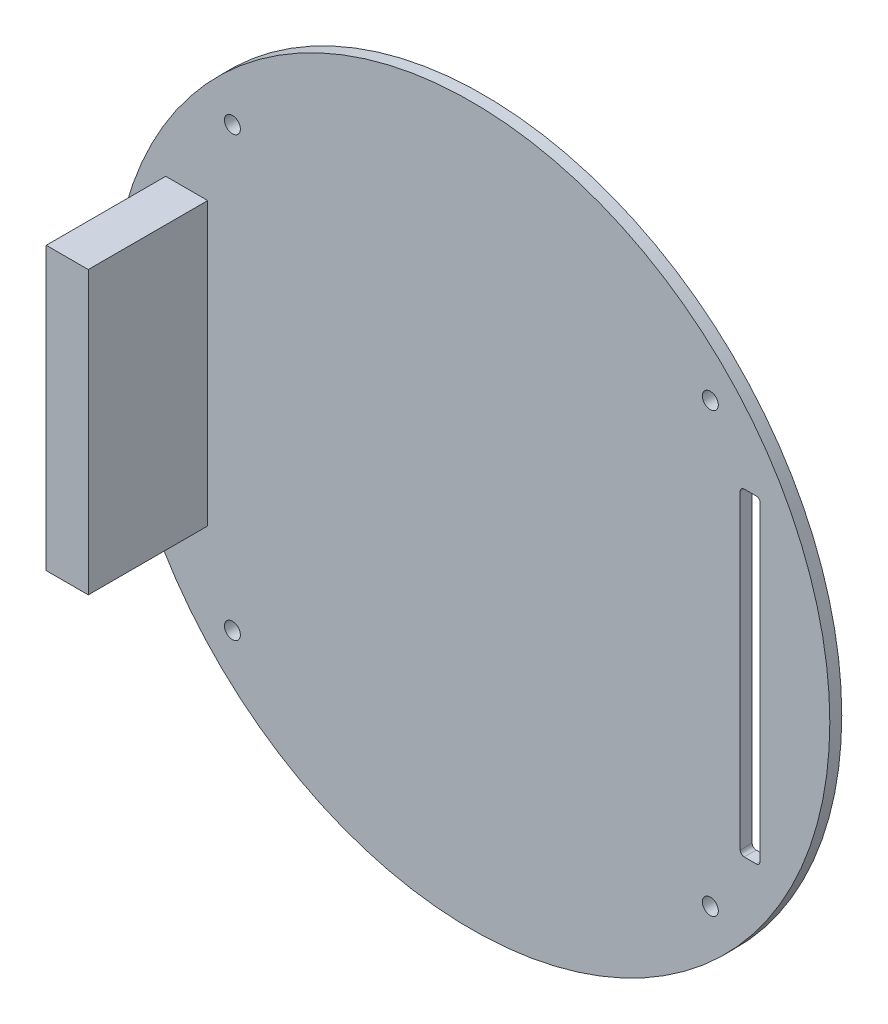
ISO-10303-21;
HEADER;
FILE_DESCRIPTION(('STEP AP214'),'2;1');
FILE_NAME('part.step','',(''),(''),'','','');
FILE_SCHEMA(('AUTOMOTIVE_DESIGN { 1 0 10303 214 1 1 1 1 }'));
ENDSEC;
DATA;
#1=APPLICATION_CONTEXT('core data for automotive mechanical design processes');
#2=APPLICATION_PROTOCOL_DEFINITION('international standard','automotive_design',2000,#1);
#3=PRODUCT_CONTEXT('',#1,'mechanical');
#4=PRODUCT('Part','Part','',(#3));
#5=PRODUCT_RELATED_PRODUCT_CATEGORY('part','',(#4));
#6=PRODUCT_DEFINITION_FORMATION('','',#4);
#7=PRODUCT_DEFINITION_CONTEXT('part definition',#1,'design');
#8=PRODUCT_DEFINITION('design','',#6,#7);
#9=PRODUCT_DEFINITION_SHAPE('','',#8);
#10=(LENGTH_UNIT() NAMED_UNIT(*) SI_UNIT(.MILLI.,.METRE.));
#11=(NAMED_UNIT(*) PLANE_ANGLE_UNIT() SI_UNIT($,.RADIAN.));
#12=(NAMED_UNIT(*) SI_UNIT($,.STERADIAN.) SOLID_ANGLE_UNIT());
#13=UNCERTAINTY_MEASURE_WITH_UNIT(LENGTH_MEASURE(1.E-05),#10,'distance_accuracy_value','');
#14=(GEOMETRIC_REPRESENTATION_CONTEXT(3) GLOBAL_UNCERTAINTY_ASSIGNED_CONTEXT((#13)) GLOBAL_UNIT_ASSIGNED_CONTEXT((#10,
#11,#12)) REPRESENTATION_CONTEXT('',''));
#15=CARTESIAN_POINT('',(0.,0.,0.));
#16=DIRECTION('',(0.,0.,1.));
#17=DIRECTION('',(1.,0.,0.));
#18=AXIS2_PLACEMENT_3D('',#15,#16,#17);
#19=CARTESIAN_POINT('',(0.,0.,3.));
#20=DIRECTION('',(0.,0.,1.));
#21=DIRECTION('',(1.,0.,0.));
#22=AXIS2_PLACEMENT_3D('',#19,#20,#21);
#23=PLANE('',#22);
#24=CARTESIAN_POINT('',(71.5,39.,3.));
#25=DIRECTION('',(0.,0.,1.));
#26=DIRECTION('',(-1.,0.,0.));
#27=AXIS2_PLACEMENT_3D('',#24,#25,#26);
#28=CIRCLE('',#27,1.);
#29=CARTESIAN_POINT('',(72.5,39.,3.));
#30=VERTEX_POINT('',#29);
#31=CARTESIAN_POINT('',(71.5,40.,3.));
#32=VERTEX_POINT('',#31);
#33=EDGE_CURVE('E62',#30,#32,#28,.T.);
#34=ORIENTED_EDGE('',*,*,#33,.F.);
#35=DIRECTION('',(0.,1.,0.));
#36=VECTOR('',#35,1.);
#37=CARTESIAN_POINT('',(72.5,-39.,3.));
#38=LINE('',#37,#36);
#39=CARTESIAN_POINT('',(72.5,-39.,3.));
#40=VERTEX_POINT('',#39);
#41=EDGE_CURVE('E169',#40,#30,#38,.T.);
#42=ORIENTED_EDGE('',*,*,#41,.F.);
#43=CARTESIAN_POINT('',(71.5,-39.,3.));
#44=DIRECTION('',(0.,0.,1.));
#45=DIRECTION('',(1.,0.,0.));
#46=AXIS2_PLACEMENT_3D('',#43,#44,#45);
#47=CIRCLE('',#46,1.);
#48=CARTESIAN_POINT('',(71.5,-40.,3.));
#49=VERTEX_POINT('',#48);
#50=EDGE_CURVE('E166',#49,#40,#47,.T.);
#51=ORIENTED_EDGE('',*,*,#50,.F.);
#52=DIRECTION('',(1.,0.,0.));
#53=VECTOR('',#52,1.);
#54=CARTESIAN_POINT('',(68.5,-40.,3.));
#55=LINE('',#54,#53);
#56=CARTESIAN_POINT('',(68.5,-40.,3.));
#57=VERTEX_POINT('',#56);
#58=EDGE_CURVE('E163',#57,#49,#55,.T.);
#59=ORIENTED_EDGE('',*,*,#58,.F.);
#60=CARTESIAN_POINT('',(68.5,-39.,3.));
#61=DIRECTION('',(0.,0.,1.));
#62=DIRECTION('',(-1.,0.,0.));
#63=AXIS2_PLACEMENT_3D('',#60,#61,#62);
#64=CIRCLE('',#63,1.);
#65=CARTESIAN_POINT('',(67.5,-39.,3.));
#66=VERTEX_POINT('',#65);
#67=EDGE_CURVE('E157',#66,#57,#64,.T.);
#68=ORIENTED_EDGE('',*,*,#67,.F.);
#69=DIRECTION('',(0.,-1.,0.));
#70=VECTOR('',#69,1.);
#71=CARTESIAN_POINT('',(67.5,-39.,3.));
#72=LINE('',#71,#70);
#73=CARTESIAN_POINT('',(67.5,39.,3.));
#74=VERTEX_POINT('',#73);
#75=EDGE_CURVE('E155',#74,#66,#72,.T.);
#76=ORIENTED_EDGE('',*,*,#75,.F.);
#77=CARTESIAN_POINT('',(68.5,39.,3.));
#78=DIRECTION('',(0.,0.,1.));
#79=DIRECTION('',(-1.,0.,0.));
#80=AXIS2_PLACEMENT_3D('',#77,#78,#79);
#81=CIRCLE('',#80,1.);
#82=CARTESIAN_POINT('',(68.5,40.,3.));
#83=VERTEX_POINT('',#82);
#84=EDGE_CURVE('E139',#83,#74,#81,.T.);
#85=ORIENTED_EDGE('',*,*,#84,.F.);
#86=DIRECTION('',(-1.,0.,0.));
#87=VECTOR('',#86,1.);
#88=CARTESIAN_POINT('',(68.5,40.,3.));
#89=LINE('',#88,#87);
#90=EDGE_CURVE('E148',#32,#83,#89,.T.);
#91=ORIENTED_EDGE('',*,*,#90,.F.);
#92=EDGE_LOOP('',(#34,#42,#51,#59,#68,#76,#85,#91));
#93=FACE_BOUND('',#92,.T.);
#94=DIRECTION('',(0.,-1.,0.));
#95=VECTOR('',#94,1.);
#96=CARTESIAN_POINT('',(-66.1949460648351,-35.37592226291,3.));
#97=LINE('',#96,#95);
#98=CARTESIAN_POINT('',(-66.1949460648351,35.3759222629101,3.));
#99=VERTEX_POINT('',#98);
#100=CARTESIAN_POINT('',(-66.1949460648351,-35.37592226291,3.));
#101=VERTEX_POINT('',#100);
#102=EDGE_CURVE('E174',#99,#101,#97,.T.);
#103=ORIENTED_EDGE('',*,*,#102,.T.);
#104=DIRECTION('',(-1.,0.,0.));
#105=VECTOR('',#104,1.);
#106=CARTESIAN_POINT('',(-76.7477635534321,-35.37592226291,3.));
#107=LINE('',#106,#105);
#108=CARTESIAN_POINT('',(-76.7477635534321,-35.37592226291,3.));
#109=VERTEX_POINT('',#108);
#110=EDGE_CURVE('E200',#101,#109,#107,.T.);
#111=ORIENTED_EDGE('',*,*,#110,.T.);
#112=DIRECTION('',(0.,1.,0.));
#113=VECTOR('',#112,1.);
#114=CARTESIAN_POINT('',(-76.7477635534321,-35.37592226291,3.));
#115=LINE('',#114,#113);
#116=CARTESIAN_POINT('',(-76.7477635534321,35.3759222629101,3.));
#117=VERTEX_POINT('',#116);
#118=EDGE_CURVE('E202',#109,#117,#115,.T.);
#119=ORIENTED_EDGE('',*,*,#118,.T.);
#120=DIRECTION('',(1.,0.,0.));
#121=VECTOR('',#120,1.);
#122=CARTESIAN_POINT('',(-76.7477635534321,35.3759222629101,3.));
#123=LINE('',#122,#121);
#124=EDGE_CURVE('E189',#117,#99,#123,.T.);
#125=ORIENTED_EDGE('',*,*,#124,.T.);
#126=EDGE_LOOP('',(#103,#111,#119,#125));
#127=FACE_BOUND('',#126,.T.);
#128=CARTESIAN_POINT('',(60.,55.,3.));
#129=DIRECTION('',(0.,0.,1.));
#130=DIRECTION('',(1.,0.,0.));
#131=AXIS2_PLACEMENT_3D('',#128,#129,#130);
#132=CIRCLE('',#131,2.);
#133=CARTESIAN_POINT('',(62.,55.,3.));
#134=VERTEX_POINT('',#133);
#135=EDGE_CURVE('E223',#134,#134,#132,.T.);
#136=ORIENTED_EDGE('',*,*,#135,.F.);
#137=EDGE_LOOP('',(#136));
#138=FACE_BOUND('',#137,.T.);
#139=CARTESIAN_POINT('',(-60.,-55.,3.));
#140=DIRECTION('',(0.,0.,1.));
#141=DIRECTION('',(1.,0.,0.));
#142=AXIS2_PLACEMENT_3D('',#139,#140,#141);
#143=CIRCLE('',#142,2.);
#144=CARTESIAN_POINT('',(-58.,-55.,3.));
#145=VERTEX_POINT('',#144);
#146=EDGE_CURVE('E235',#145,#145,#143,.T.);
#147=ORIENTED_EDGE('',*,*,#146,.F.);
#148=EDGE_LOOP('',(#147));
#149=FACE_BOUND('',#148,.T.);
#150=CARTESIAN_POINT('',(0.,0.,3.));
#151=DIRECTION('',(0.,0.,1.));
#152=DIRECTION('',(1.,0.,0.));
#153=AXIS2_PLACEMENT_3D('',#150,#151,#152);
#154=CIRCLE('',#153,90.);
#155=CARTESIAN_POINT('',(90.,0.,3.));
#156=VERTEX_POINT('',#155);
#157=EDGE_CURVE('E241',#156,#156,#154,.T.);
#158=ORIENTED_EDGE('',*,*,#157,.T.);
#159=EDGE_LOOP('',(#158));
#160=FACE_BOUND('',#159,.T.);
#161=CARTESIAN_POINT('',(-60.,55.,3.));
#162=DIRECTION('',(0.,0.,1.));
#163=DIRECTION('',(1.,0.,0.));
#164=AXIS2_PLACEMENT_3D('',#161,#162,#163);
#165=CIRCLE('',#164,2.);
#166=CARTESIAN_POINT('',(-58.,55.,3.));
#167=VERTEX_POINT('',#166);
#168=EDGE_CURVE('E229',#167,#167,#165,.T.);
#169=ORIENTED_EDGE('',*,*,#168,.F.);
#170=EDGE_LOOP('',(#169));
#171=FACE_BOUND('',#170,.T.);
#172=CARTESIAN_POINT('',(60.,-55.,3.));
#173=DIRECTION('',(0.,0.,1.));
#174=DIRECTION('',(1.,0.,0.));
#175=AXIS2_PLACEMENT_3D('',#172,#173,#174);
#176=CIRCLE('',#175,2.);
#177=CARTESIAN_POINT('',(62.,-55.,3.));
#178=VERTEX_POINT('',#177);
#179=EDGE_CURVE('E217',#178,#178,#176,.T.);
#180=ORIENTED_EDGE('',*,*,#179,.F.);
#181=EDGE_LOOP('',(#180));
#182=FACE_BOUND('',#181,.T.);
#183=ADVANCED_FACE('F47',(#93,#127,#138,#149,#160,#171,#182),#23,.T.);
#184=CARTESIAN_POINT('',(0.,0.,0.));
#185=DIRECTION('',(0.,0.,1.));
#186=DIRECTION('',(1.,0.,0.));
#187=AXIS2_PLACEMENT_3D('',#184,#185,#186);
#188=PLANE('',#187);
#189=DIRECTION('',(0.,1.,0.));
#190=VECTOR('',#189,1.);
#191=CARTESIAN_POINT('',(72.5,0.,0.));
#192=LINE('',#191,#190);
#193=CARTESIAN_POINT('',(72.5,-39.,0.));
#194=VERTEX_POINT('',#193);
#195=CARTESIAN_POINT('',(72.5,39.,0.));
#196=VERTEX_POINT('',#195);
#197=EDGE_CURVE('E55',#194,#196,#192,.T.);
#198=ORIENTED_EDGE('',*,*,#197,.T.);
#199=CARTESIAN_POINT('',(71.5,39.,0.));
#200=DIRECTION('',(0.,0.,1.));
#201=DIRECTION('',(1.,0.,0.));
#202=AXIS2_PLACEMENT_3D('',#199,#200,#201);
#203=CIRCLE('',#202,1.);
#204=CARTESIAN_POINT('',(71.5,40.,0.));
#205=VERTEX_POINT('',#204);
#206=EDGE_CURVE('E12',#196,#205,#203,.T.);
#207=ORIENTED_EDGE('',*,*,#206,.T.);
#208=DIRECTION('',(-1.,0.,0.));
#209=VECTOR('',#208,1.);
#210=CARTESIAN_POINT('',(0.,40.,0.));
#211=LINE('',#210,#209);
#212=CARTESIAN_POINT('',(68.5,40.,0.));
#213=VERTEX_POINT('',#212);
#214=EDGE_CURVE('E244',#205,#213,#211,.T.);
#215=ORIENTED_EDGE('',*,*,#214,.T.);
#216=CARTESIAN_POINT('',(68.5,39.,0.));
#217=DIRECTION('',(0.,0.,1.));
#218=DIRECTION('',(1.,0.,0.));
#219=AXIS2_PLACEMENT_3D('',#216,#217,#218);
#220=CIRCLE('',#219,1.);
#221=CARTESIAN_POINT('',(67.5,39.,0.));
#222=VERTEX_POINT('',#221);
#223=EDGE_CURVE('E142',#213,#222,#220,.T.);
#224=ORIENTED_EDGE('',*,*,#223,.T.);
#225=DIRECTION('',(0.,-1.,0.));
#226=VECTOR('',#225,1.);
#227=CARTESIAN_POINT('',(67.5,0.,0.));
#228=LINE('',#227,#226);
#229=CARTESIAN_POINT('',(67.5,-39.,0.));
#230=VERTEX_POINT('',#229);
#231=EDGE_CURVE('E249',#222,#230,#228,.T.);
#232=ORIENTED_EDGE('',*,*,#231,.T.);
#233=CARTESIAN_POINT('',(68.5,-39.,0.));
#234=DIRECTION('',(0.,0.,1.));
#235=DIRECTION('',(1.,0.,0.));
#236=AXIS2_PLACEMENT_3D('',#233,#234,#235);
#237=CIRCLE('',#236,1.);
#238=CARTESIAN_POINT('',(68.5,-40.,0.));
#239=VERTEX_POINT('',#238);
#240=EDGE_CURVE('E252',#230,#239,#237,.T.);
#241=ORIENTED_EDGE('',*,*,#240,.T.);
#242=DIRECTION('',(1.,0.,0.));
#243=VECTOR('',#242,1.);
#244=CARTESIAN_POINT('',(0.,-40.,0.));
#245=LINE('',#244,#243);
#246=CARTESIAN_POINT('',(71.5,-40.,0.));
#247=VERTEX_POINT('',#246);
#248=EDGE_CURVE('E255',#239,#247,#245,.T.);
#249=ORIENTED_EDGE('',*,*,#248,.T.);
#250=CARTESIAN_POINT('',(71.5,-39.,0.));
#251=DIRECTION('',(0.,0.,1.));
#252=DIRECTION('',(1.,0.,0.));
#253=AXIS2_PLACEMENT_3D('',#250,#251,#252);
#254=CIRCLE('',#253,1.);
#255=EDGE_CURVE('E258',#247,#194,#254,.T.);
#256=ORIENTED_EDGE('',*,*,#255,.T.);
#257=EDGE_LOOP('',(#198,#207,#215,#224,#232,#241,#249,#256));
#258=FACE_BOUND('',#257,.T.);
#259=CARTESIAN_POINT('',(0.,0.,0.));
#260=DIRECTION('',(0.,0.,1.));
#261=DIRECTION('',(1.,0.,0.));
#262=AXIS2_PLACEMENT_3D('',#259,#260,#261);
#263=CIRCLE('',#262,90.);
#264=CARTESIAN_POINT('',(90.,0.,0.));
#265=VERTEX_POINT('',#264);
#266=EDGE_CURVE('E238',#265,#265,#263,.T.);
#267=ORIENTED_EDGE('',*,*,#266,.F.);
#268=EDGE_LOOP('',(#267));
#269=FACE_BOUND('',#268,.T.);
#270=CARTESIAN_POINT('',(-60.,-55.,0.));
#271=DIRECTION('',(0.,0.,1.));
#272=DIRECTION('',(1.,0.,0.));
#273=AXIS2_PLACEMENT_3D('',#270,#271,#272);
#274=CIRCLE('',#273,2.);
#275=CARTESIAN_POINT('',(-58.,-55.,0.));
#276=VERTEX_POINT('',#275);
#277=EDGE_CURVE('E232',#276,#276,#274,.T.);
#278=ORIENTED_EDGE('',*,*,#277,.T.);
#279=EDGE_LOOP('',(#278));
#280=FACE_BOUND('',#279,.T.);
#281=CARTESIAN_POINT('',(-60.,55.,0.));
#282=DIRECTION('',(0.,0.,1.));
#283=DIRECTION('',(1.,0.,0.));
#284=AXIS2_PLACEMENT_3D('',#281,#282,#283);
#285=CIRCLE('',#284,2.);
#286=CARTESIAN_POINT('',(-58.,55.,0.));
#287=VERTEX_POINT('',#286);
#288=EDGE_CURVE('E226',#287,#287,#285,.T.);
#289=ORIENTED_EDGE('',*,*,#288,.T.);
#290=EDGE_LOOP('',(#289));
#291=FACE_BOUND('',#290,.T.);
#292=CARTESIAN_POINT('',(60.,55.,0.));
#293=DIRECTION('',(0.,0.,1.));
#294=DIRECTION('',(1.,0.,0.));
#295=AXIS2_PLACEMENT_3D('',#292,#293,#294);
#296=CIRCLE('',#295,2.);
#297=CARTESIAN_POINT('',(62.,55.,0.));
#298=VERTEX_POINT('',#297);
#299=EDGE_CURVE('E220',#298,#298,#296,.T.);
#300=ORIENTED_EDGE('',*,*,#299,.T.);
#301=EDGE_LOOP('',(#300));
#302=FACE_BOUND('',#301,.T.);
#303=CARTESIAN_POINT('',(60.,-55.,0.));
#304=DIRECTION('',(0.,0.,1.));
#305=DIRECTION('',(1.,0.,0.));
#306=AXIS2_PLACEMENT_3D('',#303,#304,#305);
#307=CIRCLE('',#306,2.);
#308=CARTESIAN_POINT('',(62.,-55.,0.));
#309=VERTEX_POINT('',#308);
#310=EDGE_CURVE('E208',#309,#309,#307,.T.);
#311=ORIENTED_EDGE('',*,*,#310,.T.);
#312=EDGE_LOOP('',(#311));
#313=FACE_BOUND('',#312,.T.);
#314=ADVANCED_FACE('F262',(#258,#269,#280,#291,#302,#313),#188,.F.);
#315=CARTESIAN_POINT('',(0.,0.,3.));
#316=DIRECTION('',(0.,0.,-1.));
#317=DIRECTION('',(-1.,0.,0.));
#318=AXIS2_PLACEMENT_3D('',#315,#316,#317);
#319=CYLINDRICAL_SURFACE('',#318,90.);
#320=ORIENTED_EDGE('',*,*,#157,.F.);
#321=EDGE_LOOP('',(#320));
#322=FACE_BOUND('',#321,.T.);
#323=ORIENTED_EDGE('',*,*,#266,.T.);
#324=EDGE_LOOP('',(#323));
#325=FACE_BOUND('',#324,.T.);
#326=ADVANCED_FACE('F49',(#322,#325),#319,.T.);
#327=CARTESIAN_POINT('',(-60.,-55.,3.));
#328=DIRECTION('',(0.,0.,-1.));
#329=DIRECTION('',(-1.,0.,0.));
#330=AXIS2_PLACEMENT_3D('',#327,#328,#329);
#331=CYLINDRICAL_SURFACE('',#330,2.);
#332=ORIENTED_EDGE('',*,*,#146,.T.);
#333=EDGE_LOOP('',(#332));
#334=FACE_BOUND('',#333,.T.);
#335=ORIENTED_EDGE('',*,*,#277,.F.);
#336=EDGE_LOOP('',(#335));
#337=FACE_BOUND('',#336,.T.);
#338=ADVANCED_FACE('F302',(#334,#337),#331,.F.);
#339=CARTESIAN_POINT('',(-60.,55.,3.));
#340=DIRECTION('',(0.,0.,-1.));
#341=DIRECTION('',(-1.,0.,0.));
#342=AXIS2_PLACEMENT_3D('',#339,#340,#341);
#343=CYLINDRICAL_SURFACE('',#342,2.);
#344=ORIENTED_EDGE('',*,*,#168,.T.);
#345=EDGE_LOOP('',(#344));
#346=FACE_BOUND('',#345,.T.);
#347=ORIENTED_EDGE('',*,*,#288,.F.);
#348=EDGE_LOOP('',(#347));
#349=FACE_BOUND('',#348,.T.);
#350=ADVANCED_FACE('F305',(#346,#349),#343,.F.);
#351=CARTESIAN_POINT('',(60.,55.,3.));
#352=DIRECTION('',(0.,0.,-1.));
#353=DIRECTION('',(-1.,0.,0.));
#354=AXIS2_PLACEMENT_3D('',#351,#352,#353);
#355=CYLINDRICAL_SURFACE('',#354,2.);
#356=ORIENTED_EDGE('',*,*,#135,.T.);
#357=EDGE_LOOP('',(#356));
#358=FACE_BOUND('',#357,.T.);
#359=ORIENTED_EDGE('',*,*,#299,.F.);
#360=EDGE_LOOP('',(#359));
#361=FACE_BOUND('',#360,.T.);
#362=ADVANCED_FACE('F309',(#358,#361),#355,.F.);
#363=CARTESIAN_POINT('',(60.,-55.,3.));
#364=DIRECTION('',(0.,0.,-1.));
#365=DIRECTION('',(-1.,0.,0.));
#366=AXIS2_PLACEMENT_3D('',#363,#364,#365);
#367=CYLINDRICAL_SURFACE('',#366,2.);
#368=ORIENTED_EDGE('',*,*,#179,.T.);
#369=EDGE_LOOP('',(#368));
#370=FACE_BOUND('',#369,.T.);
#371=ORIENTED_EDGE('',*,*,#310,.F.);
#372=EDGE_LOOP('',(#371));
#373=FACE_BOUND('',#372,.T.);
#374=ADVANCED_FACE('F313',(#370,#373),#367,.F.);
#375=CARTESIAN_POINT('',(-66.1949460648351,-35.37592226291,33.));
#376=DIRECTION('',(1.,0.,0.));
#377=DIRECTION('',(0.,0.,-1.));
#378=AXIS2_PLACEMENT_3D('',#375,#376,#377);
#379=PLANE('',#378);
#380=ORIENTED_EDGE('',*,*,#102,.F.);
#381=DIRECTION('',(0.,0.,-1.));
#382=VECTOR('',#381,1.);
#383=CARTESIAN_POINT('',(-66.1949460648351,35.3759222629101,33.));
#384=LINE('',#383,#382);
#385=CARTESIAN_POINT('',(-66.1949460648351,35.3759222629101,33.));
#386=VERTEX_POINT('',#385);
#387=EDGE_CURVE('E205',#386,#99,#384,.T.);
#388=ORIENTED_EDGE('',*,*,#387,.F.);
#389=DIRECTION('',(0.,-1.,0.));
#390=VECTOR('',#389,1.);
#391=CARTESIAN_POINT('',(-66.1949460648351,-35.37592226291,33.));
#392=LINE('',#391,#390);
#393=CARTESIAN_POINT('',(-66.1949460648351,-35.37592226291,33.));
#394=VERTEX_POINT('',#393);
#395=EDGE_CURVE('E185',#386,#394,#392,.T.);
#396=ORIENTED_EDGE('',*,*,#395,.T.);
#397=DIRECTION('',(0.,0.,-1.));
#398=VECTOR('',#397,1.);
#399=CARTESIAN_POINT('',(-66.1949460648351,-35.37592226291,33.));
#400=LINE('',#399,#398);
#401=EDGE_CURVE('E198',#394,#101,#400,.T.);
#402=ORIENTED_EDGE('',*,*,#401,.T.);
#403=EDGE_LOOP('',(#380,#388,#396,#402));
#404=FACE_BOUND('',#403,.T.);
#405=ADVANCED_FACE('F317',(#404),#379,.T.);
#406=CARTESIAN_POINT('',(-76.7477635534321,35.3759222629101,33.));
#407=DIRECTION('',(0.,1.,0.));
#408=DIRECTION('',(0.,0.,1.));
#409=AXIS2_PLACEMENT_3D('',#406,#407,#408);
#410=PLANE('',#409);
#411=ORIENTED_EDGE('',*,*,#124,.F.);
#412=DIRECTION('',(0.,0.,-1.));
#413=VECTOR('',#412,1.);
#414=CARTESIAN_POINT('',(-76.7477635534321,35.3759222629101,33.));
#415=LINE('',#414,#413);
#416=CARTESIAN_POINT('',(-76.7477635534321,35.3759222629101,33.));
#417=VERTEX_POINT('',#416);
#418=EDGE_CURVE('E209',#417,#117,#415,.T.);
#419=ORIENTED_EDGE('',*,*,#418,.F.);
#420=DIRECTION('',(1.,0.,0.));
#421=VECTOR('',#420,1.);
#422=CARTESIAN_POINT('',(-76.7477635534321,35.3759222629101,33.));
#423=LINE('',#422,#421);
#424=EDGE_CURVE('E195',#417,#386,#423,.T.);
#425=ORIENTED_EDGE('',*,*,#424,.T.);
#426=ORIENTED_EDGE('',*,*,#387,.T.);
#427=EDGE_LOOP('',(#411,#419,#425,#426));
#428=FACE_BOUND('',#427,.T.);
#429=ADVANCED_FACE('F321',(#428),#410,.T.);
#430=CARTESIAN_POINT('',(-76.7477635534321,-35.37592226291,33.));
#431=DIRECTION('',(-1.,0.,0.));
#432=DIRECTION('',(0.,0.,1.));
#433=AXIS2_PLACEMENT_3D('',#430,#431,#432);
#434=PLANE('',#433);
#435=ORIENTED_EDGE('',*,*,#118,.F.);
#436=DIRECTION('',(0.,0.,-1.));
#437=VECTOR('',#436,1.);
#438=CARTESIAN_POINT('',(-76.7477635534321,-35.37592226291,33.));
#439=LINE('',#438,#437);
#440=CARTESIAN_POINT('',(-76.7477635534321,-35.37592226291,33.));
#441=VERTEX_POINT('',#440);
#442=EDGE_CURVE('E212',#441,#109,#439,.T.);
#443=ORIENTED_EDGE('',*,*,#442,.F.);
#444=DIRECTION('',(0.,1.,0.));
#445=VECTOR('',#444,1.);
#446=CARTESIAN_POINT('',(-76.7477635534321,-35.37592226291,33.));
#447=LINE('',#446,#445);
#448=EDGE_CURVE('E192',#441,#417,#447,.T.);
#449=ORIENTED_EDGE('',*,*,#448,.T.);
#450=ORIENTED_EDGE('',*,*,#418,.T.);
#451=EDGE_LOOP('',(#435,#443,#449,#450));
#452=FACE_BOUND('',#451,.T.);
#453=ADVANCED_FACE('F325',(#452),#434,.T.);
#454=CARTESIAN_POINT('',(-76.7477635534321,-35.37592226291,33.));
#455=DIRECTION('',(0.,-1.,0.));
#456=DIRECTION('',(0.,0.,-1.));
#457=AXIS2_PLACEMENT_3D('',#454,#455,#456);
#458=PLANE('',#457);
#459=ORIENTED_EDGE('',*,*,#110,.F.);
#460=ORIENTED_EDGE('',*,*,#401,.F.);
#461=DIRECTION('',(-1.,0.,0.));
#462=VECTOR('',#461,1.);
#463=CARTESIAN_POINT('',(-76.7477635534321,-35.37592226291,33.));
#464=LINE('',#463,#462);
#465=EDGE_CURVE('E188',#394,#441,#464,.T.);
#466=ORIENTED_EDGE('',*,*,#465,.T.);
#467=ORIENTED_EDGE('',*,*,#442,.T.);
#468=EDGE_LOOP('',(#459,#460,#466,#467));
#469=FACE_BOUND('',#468,.T.);
#470=ADVANCED_FACE('F291',(#469),#458,.T.);
#471=CARTESIAN_POINT('',(0.,0.,33.));
#472=DIRECTION('',(0.,0.,-1.));
#473=DIRECTION('',(-1.,0.,0.));
#474=AXIS2_PLACEMENT_3D('',#471,#472,#473);
#475=PLANE('',#474);
#476=ORIENTED_EDGE('',*,*,#395,.F.);
#477=ORIENTED_EDGE('',*,*,#424,.F.);
#478=ORIENTED_EDGE('',*,*,#448,.F.);
#479=ORIENTED_EDGE('',*,*,#465,.F.);
#480=EDGE_LOOP('',(#476,#477,#478,#479));
#481=FACE_BOUND('',#480,.T.);
#482=ADVANCED_FACE('F284',(#481),#475,.F.);
#483=CARTESIAN_POINT('',(71.5,39.,-27.));
#484=DIRECTION('',(0.,0.,1.));
#485=DIRECTION('',(1.,0.,0.));
#486=AXIS2_PLACEMENT_3D('',#483,#484,#485);
#487=CYLINDRICAL_SURFACE('',#486,1.);
#488=DIRECTION('',(0.,0.,1.));
#489=VECTOR('',#488,1.);
#490=CARTESIAN_POINT('',(72.5,39.,-27.));
#491=LINE('',#490,#489);
#492=EDGE_CURVE('E172',#196,#30,#491,.T.);
#493=ORIENTED_EDGE('',*,*,#492,.T.);
#494=ORIENTED_EDGE('',*,*,#33,.T.);
#495=DIRECTION('',(0.,0.,1.));
#496=VECTOR('',#495,1.);
#497=CARTESIAN_POINT('',(71.5,40.,-27.));
#498=LINE('',#497,#496);
#499=EDGE_CURVE('E145',#205,#32,#498,.T.);
#500=ORIENTED_EDGE('',*,*,#499,.F.);
#501=ORIENTED_EDGE('',*,*,#206,.F.);
#502=EDGE_LOOP('',(#493,#494,#500,#501));
#503=FACE_BOUND('',#502,.T.);
#504=ADVANCED_FACE('F282',(#503),#487,.F.);
#505=CARTESIAN_POINT('',(72.5,-39.,-27.));
#506=DIRECTION('',(1.,0.,0.));
#507=DIRECTION('',(0.,0.,-1.));
#508=AXIS2_PLACEMENT_3D('',#505,#506,#507);
#509=PLANE('',#508);
#510=DIRECTION('',(0.,0.,1.));
#511=VECTOR('',#510,1.);
#512=CARTESIAN_POINT('',(72.5,-39.,-27.));
#513=LINE('',#512,#511);
#514=EDGE_CURVE('E175',#194,#40,#513,.T.);
#515=ORIENTED_EDGE('',*,*,#514,.T.);
#516=ORIENTED_EDGE('',*,*,#41,.T.);
#517=ORIENTED_EDGE('',*,*,#492,.F.);
#518=ORIENTED_EDGE('',*,*,#197,.F.);
#519=EDGE_LOOP('',(#515,#516,#517,#518));
#520=FACE_BOUND('',#519,.T.);
#521=ADVANCED_FACE('F267',(#520),#509,.F.);
#522=CARTESIAN_POINT('',(71.5,-39.,-27.));
#523=DIRECTION('',(0.,0.,1.));
#524=DIRECTION('',(1.,0.,0.));
#525=AXIS2_PLACEMENT_3D('',#522,#523,#524);
#526=CYLINDRICAL_SURFACE('',#525,1.);
#527=DIRECTION('',(0.,0.,1.));
#528=VECTOR('',#527,1.);
#529=CARTESIAN_POINT('',(71.5,-40.,-27.));
#530=LINE('',#529,#528);
#531=EDGE_CURVE('E177',#247,#49,#530,.T.);
#532=ORIENTED_EDGE('',*,*,#531,.T.);
#533=ORIENTED_EDGE('',*,*,#50,.T.);
#534=ORIENTED_EDGE('',*,*,#514,.F.);
#535=ORIENTED_EDGE('',*,*,#255,.F.);
#536=EDGE_LOOP('',(#532,#533,#534,#535));
#537=FACE_BOUND('',#536,.T.);
#538=ADVANCED_FACE('F269',(#537),#526,.F.);
#539=CARTESIAN_POINT('',(68.5,-40.,-27.));
#540=DIRECTION('',(0.,-1.,0.));
#541=DIRECTION('',(0.,0.,-1.));
#542=AXIS2_PLACEMENT_3D('',#539,#540,#541);
#543=PLANE('',#542);
#544=DIRECTION('',(0.,0.,1.));
#545=VECTOR('',#544,1.);
#546=CARTESIAN_POINT('',(68.5,-40.,-27.));
#547=LINE('',#546,#545);
#548=EDGE_CURVE('E179',#239,#57,#547,.T.);
#549=ORIENTED_EDGE('',*,*,#548,.T.);
#550=ORIENTED_EDGE('',*,*,#58,.T.);
#551=ORIENTED_EDGE('',*,*,#531,.F.);
#552=ORIENTED_EDGE('',*,*,#248,.F.);
#553=EDGE_LOOP('',(#549,#550,#551,#552));
#554=FACE_BOUND('',#553,.T.);
#555=ADVANCED_FACE('F275',(#554),#543,.F.);
#556=CARTESIAN_POINT('',(68.5,-39.,-27.));
#557=DIRECTION('',(0.,0.,1.));
#558=DIRECTION('',(1.,0.,0.));
#559=AXIS2_PLACEMENT_3D('',#556,#557,#558);
#560=CYLINDRICAL_SURFACE('',#559,1.);
#561=DIRECTION('',(0.,0.,1.));
#562=VECTOR('',#561,1.);
#563=CARTESIAN_POINT('',(67.5,-39.,-27.));
#564=LINE('',#563,#562);
#565=EDGE_CURVE('E181',#230,#66,#564,.T.);
#566=ORIENTED_EDGE('',*,*,#565,.T.);
#567=ORIENTED_EDGE('',*,*,#67,.T.);
#568=ORIENTED_EDGE('',*,*,#548,.F.);
#569=ORIENTED_EDGE('',*,*,#240,.F.);
#570=EDGE_LOOP('',(#566,#567,#568,#569));
#571=FACE_BOUND('',#570,.T.);
#572=ADVANCED_FACE('F278',(#571),#560,.F.);
#573=CARTESIAN_POINT('',(67.5,-39.,-27.));
#574=DIRECTION('',(-1.,0.,0.));
#575=DIRECTION('',(0.,0.,1.));
#576=AXIS2_PLACEMENT_3D('',#573,#574,#575);
#577=PLANE('',#576);
#578=DIRECTION('',(0.,0.,1.));
#579=VECTOR('',#578,1.);
#580=CARTESIAN_POINT('',(67.5,39.,-27.));
#581=LINE('',#580,#579);
#582=EDGE_CURVE('E144',#222,#74,#581,.T.);
#583=ORIENTED_EDGE('',*,*,#582,.T.);
#584=ORIENTED_EDGE('',*,*,#75,.T.);
#585=ORIENTED_EDGE('',*,*,#565,.F.);
#586=ORIENTED_EDGE('',*,*,#231,.F.);
#587=EDGE_LOOP('',(#583,#584,#585,#586));
#588=FACE_BOUND('',#587,.T.);
#589=ADVANCED_FACE('F281',(#588),#577,.F.);
#590=CARTESIAN_POINT('',(68.5,39.,-27.));
#591=DIRECTION('',(0.,0.,1.));
#592=DIRECTION('',(1.,0.,0.));
#593=AXIS2_PLACEMENT_3D('',#590,#591,#592);
#594=CYLINDRICAL_SURFACE('',#593,1.);
#595=DIRECTION('',(0.,0.,1.));
#596=VECTOR('',#595,1.);
#597=CARTESIAN_POINT('',(68.5,40.,-27.));
#598=LINE('',#597,#596);
#599=EDGE_CURVE('E70',#213,#83,#598,.T.);
#600=ORIENTED_EDGE('',*,*,#599,.T.);
#601=ORIENTED_EDGE('',*,*,#84,.T.);
#602=ORIENTED_EDGE('',*,*,#582,.F.);
#603=ORIENTED_EDGE('',*,*,#223,.F.);
#604=EDGE_LOOP('',(#600,#601,#602,#603));
#605=FACE_BOUND('',#604,.T.);
#606=ADVANCED_FACE('F136',(#605),#594,.F.);
#607=CARTESIAN_POINT('',(68.5,40.,-27.));
#608=DIRECTION('',(0.,1.,0.));
#609=DIRECTION('',(0.,0.,1.));
#610=AXIS2_PLACEMENT_3D('',#607,#608,#609);
#611=PLANE('',#610);
#612=ORIENTED_EDGE('',*,*,#499,.T.);
#613=ORIENTED_EDGE('',*,*,#90,.T.);
#614=ORIENTED_EDGE('',*,*,#599,.F.);
#615=ORIENTED_EDGE('',*,*,#214,.F.);
#616=EDGE_LOOP('',(#612,#613,#614,#615));
#617=FACE_BOUND('',#616,.T.);
#618=ADVANCED_FACE('F149',(#617),#611,.F.);
#619=CLOSED_SHELL('',(#183,#314,#326,#338,#350,#362,#374,#405,#429,#453,#470,#482,#504,#521,
#538,#555,#572,#589,#606,#618));
#620=MANIFOLD_SOLID_BREP('B2',#619);
#621=ADVANCED_BREP_SHAPE_REPRESENTATION('',(#18,#620),#14);
#622=SHAPE_DEFINITION_REPRESENTATION(#9,#621);
ENDSEC;
END-ISO-10303-21;
